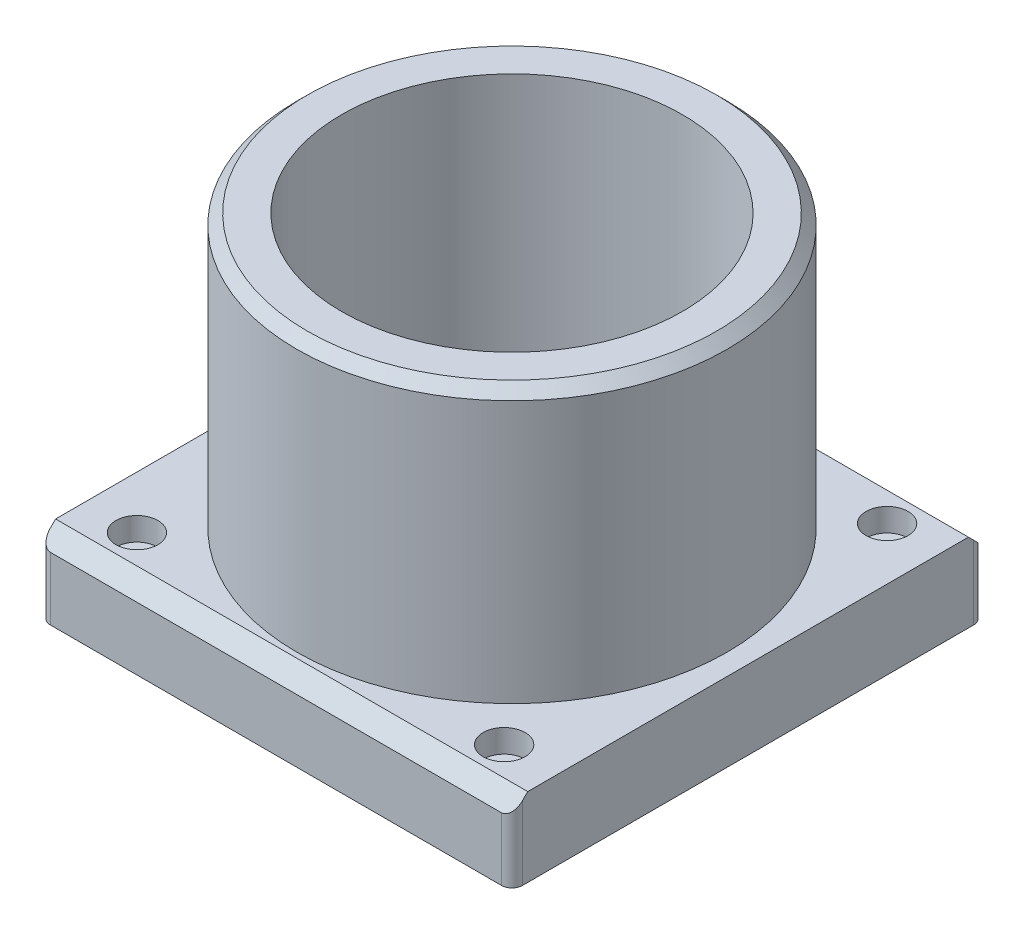
ISO-10303-21;
HEADER;
FILE_DESCRIPTION(('STEP AP214'),'2;1');
FILE_NAME('part.step','',(''),(''),'','','');
FILE_SCHEMA(('AUTOMOTIVE_DESIGN { 1 0 10303 214 1 1 1 1 }'));
ENDSEC;
DATA;
#1=APPLICATION_CONTEXT('core data for automotive mechanical design processes');
#2=APPLICATION_PROTOCOL_DEFINITION('international standard','automotive_design',2000,#1);
#3=PRODUCT_CONTEXT('',#1,'mechanical');
#4=PRODUCT('Part','Part','',(#3));
#5=PRODUCT_RELATED_PRODUCT_CATEGORY('part','',(#4));
#6=PRODUCT_DEFINITION_FORMATION('','',#4);
#7=PRODUCT_DEFINITION_CONTEXT('part definition',#1,'design');
#8=PRODUCT_DEFINITION('design','',#6,#7);
#9=PRODUCT_DEFINITION_SHAPE('','',#8);
#10=(LENGTH_UNIT() NAMED_UNIT(*) SI_UNIT(.MILLI.,.METRE.));
#11=(NAMED_UNIT(*) PLANE_ANGLE_UNIT() SI_UNIT($,.RADIAN.));
#12=(NAMED_UNIT(*) SI_UNIT($,.STERADIAN.) SOLID_ANGLE_UNIT());
#13=UNCERTAINTY_MEASURE_WITH_UNIT(LENGTH_MEASURE(1.E-05),#10,'distance_accuracy_value','');
#14=(GEOMETRIC_REPRESENTATION_CONTEXT(3) GLOBAL_UNCERTAINTY_ASSIGNED_CONTEXT((#13)) GLOBAL_UNIT_ASSIGNED_CONTEXT((#10,
#11,#12)) REPRESENTATION_CONTEXT('',''));
#15=CARTESIAN_POINT('',(0.,0.,0.));
#16=DIRECTION('',(0.,0.,1.));
#17=DIRECTION('',(1.,0.,0.));
#18=AXIS2_PLACEMENT_3D('',#15,#16,#17);
#19=CARTESIAN_POINT('',(0.,15.,0.));
#20=DIRECTION('',(0.,1.,0.));
#21=DIRECTION('',(0.,0.,1.));
#22=AXIS2_PLACEMENT_3D('',#19,#20,#21);
#23=PLANE('',#22);
#24=CARTESIAN_POINT('',(-35.,15.,-36.5));
#25=DIRECTION('',(0.,1.,0.));
#26=DIRECTION('',(0.,0.,1.));
#27=AXIS2_PLACEMENT_3D('',#24,#25,#26);
#28=CIRCLE('',#27,4.);
#29=CARTESIAN_POINT('',(-35.,15.,-32.5));
#30=VERTEX_POINT('',#29);
#31=EDGE_CURVE('E454',#30,#30,#28,.T.);
#32=ORIENTED_EDGE('',*,*,#31,.F.);
#33=EDGE_LOOP('',(#32));
#34=FACE_BOUND('',#33,.T.);
#35=CARTESIAN_POINT('',(35.,15.,-36.5));
#36=DIRECTION('',(0.,1.,0.));
#37=DIRECTION('',(0.,0.,1.));
#38=AXIS2_PLACEMENT_3D('',#35,#36,#37);
#39=CIRCLE('',#38,4.);
#40=CARTESIAN_POINT('',(35.,15.,-32.5));
#41=VERTEX_POINT('',#40);
#42=EDGE_CURVE('E468',#41,#41,#39,.T.);
#43=ORIENTED_EDGE('',*,*,#42,.F.);
#44=EDGE_LOOP('',(#43));
#45=FACE_BOUND('',#44,.T.);
#46=CARTESIAN_POINT('',(-35.,15.,36.5));
#47=DIRECTION('',(0.,1.,0.));
#48=DIRECTION('',(0.,0.,1.));
#49=AXIS2_PLACEMENT_3D('',#46,#47,#48);
#50=CIRCLE('',#49,4.);
#51=CARTESIAN_POINT('',(-35.,15.,40.5));
#52=VERTEX_POINT('',#51);
#53=EDGE_CURVE('E480',#52,#52,#50,.T.);
#54=ORIENTED_EDGE('',*,*,#53,.F.);
#55=EDGE_LOOP('',(#54));
#56=FACE_BOUND('',#55,.T.);
#57=CARTESIAN_POINT('',(35.,15.,36.5));
#58=DIRECTION('',(0.,1.,0.));
#59=DIRECTION('',(0.,0.,1.));
#60=AXIS2_PLACEMENT_3D('',#57,#58,#59);
#61=CIRCLE('',#60,4.);
#62=CARTESIAN_POINT('',(35.,15.,40.5));
#63=VERTEX_POINT('',#62);
#64=EDGE_CURVE('E492',#63,#63,#61,.T.);
#65=ORIENTED_EDGE('',*,*,#64,.F.);
#66=EDGE_LOOP('',(#65));
#67=FACE_BOUND('',#66,.T.);
#68=DIRECTION('',(0.,0.,-1.));
#69=VECTOR('',#68,1.);
#70=CARTESIAN_POINT('',(45.,15.,-45.));
#71=LINE('',#70,#69);
#72=CARTESIAN_POINT('',(45.,15.,42.));
#73=VERTEX_POINT('',#72);
#74=CARTESIAN_POINT('',(45.,15.,-42.));
#75=VERTEX_POINT('',#74);
#76=EDGE_CURVE('E139',#73,#75,#71,.T.);
#77=ORIENTED_EDGE('',*,*,#76,.T.);
#78=DIRECTION('',(-1.,0.,0.));
#79=VECTOR('',#78,1.);
#80=CARTESIAN_POINT('',(-45.,15.,-42.));
#81=LINE('',#80,#79);
#82=CARTESIAN_POINT('',(-45.,15.,-42.));
#83=VERTEX_POINT('',#82);
#84=EDGE_CURVE('E121',#75,#83,#81,.T.);
#85=ORIENTED_EDGE('',*,*,#84,.T.);
#86=DIRECTION('',(0.,0.,1.));
#87=VECTOR('',#86,1.);
#88=CARTESIAN_POINT('',(-45.,15.,-45.));
#89=LINE('',#88,#87);
#90=CARTESIAN_POINT('',(-45.,15.,42.));
#91=VERTEX_POINT('',#90);
#92=EDGE_CURVE('E136',#83,#91,#89,.T.);
#93=ORIENTED_EDGE('',*,*,#92,.T.);
#94=DIRECTION('',(1.,0.,0.));
#95=VECTOR('',#94,1.);
#96=CARTESIAN_POINT('',(45.,15.,42.));
#97=LINE('',#96,#95);
#98=EDGE_CURVE('E140',#91,#73,#97,.T.);
#99=ORIENTED_EDGE('',*,*,#98,.T.);
#100=EDGE_LOOP('',(#77,#85,#93,#99));
#101=FACE_BOUND('',#100,.T.);
#102=CARTESIAN_POINT('',(0.,15.,0.));
#103=DIRECTION('',(0.,1.,0.));
#104=DIRECTION('',(0.,0.,1.));
#105=AXIS2_PLACEMENT_3D('',#102,#103,#104);
#106=CIRCLE('',#105,41.);
#107=CARTESIAN_POINT('',(0.,15.,-41.));
#108=VERTEX_POINT('',#107);
#109=EDGE_CURVE('E150',#108,#108,#106,.T.);
#110=ORIENTED_EDGE('',*,*,#109,.F.);
#111=EDGE_LOOP('',(#110));
#112=FACE_BOUND('',#111,.T.);
#113=ADVANCED_FACE('F37',(#34,#45,#56,#67,#101,#112),#23,.T.);
#114=CARTESIAN_POINT('',(-45.,15.,-45.));
#115=DIRECTION('',(1.,0.,0.));
#116=DIRECTION('',(0.,0.,-1.));
#117=AXIS2_PLACEMENT_3D('',#114,#115,#116);
#118=PLANE('',#117);
#119=DIRECTION('',(0.,-0.707106781186549,-0.707106781186546));
#120=VECTOR('',#119,1.);
#121=CARTESIAN_POINT('',(-45.,15.,-42.));
#122=LINE('',#121,#120);
#123=CARTESIAN_POINT('',(-45.,14.,-43.));
#124=VERTEX_POINT('',#123);
#125=EDGE_CURVE('E116',#83,#124,#122,.T.);
#126=ORIENTED_EDGE('',*,*,#125,.T.);
#127=DIRECTION('',(0.,-1.,0.));
#128=VECTOR('',#127,1.);
#129=CARTESIAN_POINT('',(-45.,15.,-43.));
#130=LINE('',#129,#128);
#131=CARTESIAN_POINT('',(-45.,0.,-43.));
#132=VERTEX_POINT('',#131);
#133=EDGE_CURVE('E173',#124,#132,#130,.T.);
#134=ORIENTED_EDGE('',*,*,#133,.T.);
#135=DIRECTION('',(0.,0.,1.));
#136=VECTOR('',#135,1.);
#137=CARTESIAN_POINT('',(-45.,0.,-45.));
#138=LINE('',#137,#136);
#139=CARTESIAN_POINT('',(-45.,0.,43.));
#140=VERTEX_POINT('',#139);
#141=EDGE_CURVE('E153',#132,#140,#138,.T.);
#142=ORIENTED_EDGE('',*,*,#141,.T.);
#143=DIRECTION('',(0.,-1.,0.));
#144=VECTOR('',#143,1.);
#145=CARTESIAN_POINT('',(-45.,15.,43.));
#146=LINE('',#145,#144);
#147=CARTESIAN_POINT('',(-45.,14.,43.));
#148=VERTEX_POINT('',#147);
#149=EDGE_CURVE('E171',#140,#148,#146,.F.);
#150=ORIENTED_EDGE('',*,*,#149,.T.);
#151=DIRECTION('',(0.,0.707106781186549,-0.707106781186546));
#152=VECTOR('',#151,1.);
#153=CARTESIAN_POINT('',(-45.,15.,42.));
#154=LINE('',#153,#152);
#155=EDGE_CURVE('E129',#148,#91,#154,.T.);
#156=ORIENTED_EDGE('',*,*,#155,.T.);
#157=ORIENTED_EDGE('',*,*,#92,.F.);
#158=EDGE_LOOP('',(#126,#134,#142,#150,#156,#157));
#159=FACE_BOUND('',#158,.T.);
#160=ADVANCED_FACE('F142',(#159),#118,.F.);
#161=CARTESIAN_POINT('',(-45.,15.,45.));
#162=DIRECTION('',(0.,0.,-1.));
#163=DIRECTION('',(-1.,0.,0.));
#164=AXIS2_PLACEMENT_3D('',#161,#162,#163);
#165=PLANE('',#164);
#166=DIRECTION('',(1.,0.,0.));
#167=VECTOR('',#166,1.);
#168=CARTESIAN_POINT('',(-45.,0.,45.));
#169=LINE('',#168,#167);
#170=CARTESIAN_POINT('',(-43.,0.,45.));
#171=VERTEX_POINT('',#170);
#172=CARTESIAN_POINT('',(43.,0.,45.));
#173=VERTEX_POINT('',#172);
#174=EDGE_CURVE('E156',#171,#173,#169,.T.);
#175=ORIENTED_EDGE('',*,*,#174,.T.);
#176=DIRECTION('',(0.,-1.,0.));
#177=VECTOR('',#176,1.);
#178=CARTESIAN_POINT('',(43.,15.,45.));
#179=LINE('',#178,#177);
#180=CARTESIAN_POINT('',(43.,12.,45.));
#181=VERTEX_POINT('',#180);
#182=EDGE_CURVE('E59',#173,#181,#179,.F.);
#183=ORIENTED_EDGE('',*,*,#182,.T.);
#184=DIRECTION('',(-1.,0.,0.));
#185=VECTOR('',#184,1.);
#186=CARTESIAN_POINT('',(-45.,12.,45.));
#187=LINE('',#186,#185);
#188=CARTESIAN_POINT('',(-43.,12.,45.));
#189=VERTEX_POINT('',#188);
#190=EDGE_CURVE('E169',#181,#189,#187,.T.);
#191=ORIENTED_EDGE('',*,*,#190,.T.);
#192=DIRECTION('',(0.,-1.,0.));
#193=VECTOR('',#192,1.);
#194=CARTESIAN_POINT('',(-43.,15.,45.));
#195=LINE('',#194,#193);
#196=EDGE_CURVE('E196',#189,#171,#195,.T.);
#197=ORIENTED_EDGE('',*,*,#196,.T.);
#198=EDGE_LOOP('',(#175,#183,#191,#197));
#199=FACE_BOUND('',#198,.T.);
#200=ADVANCED_FACE('F227',(#199),#165,.F.);
#201=CARTESIAN_POINT('',(45.,15.,-45.));
#202=DIRECTION('',(-1.,0.,0.));
#203=DIRECTION('',(0.,0.,1.));
#204=AXIS2_PLACEMENT_3D('',#201,#202,#203);
#205=PLANE('',#204);
#206=DIRECTION('',(0.,0.,-1.));
#207=VECTOR('',#206,1.);
#208=CARTESIAN_POINT('',(45.,0.,-45.));
#209=LINE('',#208,#207);
#210=CARTESIAN_POINT('',(45.,0.,43.));
#211=VERTEX_POINT('',#210);
#212=CARTESIAN_POINT('',(45.,0.,-43.));
#213=VERTEX_POINT('',#212);
#214=EDGE_CURVE('E147',#211,#213,#209,.T.);
#215=ORIENTED_EDGE('',*,*,#214,.T.);
#216=DIRECTION('',(0.,-1.,0.));
#217=VECTOR('',#216,1.);
#218=CARTESIAN_POINT('',(45.,15.,-43.));
#219=LINE('',#218,#217);
#220=CARTESIAN_POINT('',(45.,14.,-43.));
#221=VERTEX_POINT('',#220);
#222=EDGE_CURVE('E194',#213,#221,#219,.F.);
#223=ORIENTED_EDGE('',*,*,#222,.T.);
#224=DIRECTION('',(0.,0.707106781186549,0.707106781186546));
#225=VECTOR('',#224,1.);
#226=CARTESIAN_POINT('',(45.,15.,-42.));
#227=LINE('',#226,#225);
#228=EDGE_CURVE('E167',#221,#75,#227,.T.);
#229=ORIENTED_EDGE('',*,*,#228,.T.);
#230=ORIENTED_EDGE('',*,*,#76,.F.);
#231=DIRECTION('',(0.,-0.707106781186549,0.707106781186546));
#232=VECTOR('',#231,1.);
#233=CARTESIAN_POINT('',(45.,15.,42.));
#234=LINE('',#233,#232);
#235=CARTESIAN_POINT('',(45.,14.,43.));
#236=VERTEX_POINT('',#235);
#237=EDGE_CURVE('E164',#73,#236,#234,.T.);
#238=ORIENTED_EDGE('',*,*,#237,.T.);
#239=DIRECTION('',(0.,-1.,0.));
#240=VECTOR('',#239,1.);
#241=CARTESIAN_POINT('',(45.,15.,43.));
#242=LINE('',#241,#240);
#243=EDGE_CURVE('E191',#236,#211,#242,.T.);
#244=ORIENTED_EDGE('',*,*,#243,.T.);
#245=EDGE_LOOP('',(#215,#223,#229,#230,#238,#244));
#246=FACE_BOUND('',#245,.T.);
#247=ADVANCED_FACE('F242',(#246),#205,.F.);
#248=CARTESIAN_POINT('',(-45.,15.,-45.));
#249=DIRECTION('',(0.,0.,1.));
#250=DIRECTION('',(1.,0.,0.));
#251=AXIS2_PLACEMENT_3D('',#248,#249,#250);
#252=PLANE('',#251);
#253=DIRECTION('',(-1.,0.,0.));
#254=VECTOR('',#253,1.);
#255=CARTESIAN_POINT('',(-45.,0.,-45.));
#256=LINE('',#255,#254);
#257=CARTESIAN_POINT('',(43.,0.,-45.));
#258=VERTEX_POINT('',#257);
#259=CARTESIAN_POINT('',(-43.,0.,-45.));
#260=VERTEX_POINT('',#259);
#261=EDGE_CURVE('E143',#258,#260,#256,.T.);
#262=ORIENTED_EDGE('',*,*,#261,.T.);
#263=DIRECTION('',(0.,-1.,0.));
#264=VECTOR('',#263,1.);
#265=CARTESIAN_POINT('',(-43.,15.,-45.));
#266=LINE('',#265,#264);
#267=CARTESIAN_POINT('',(-43.,12.,-45.));
#268=VERTEX_POINT('',#267);
#269=EDGE_CURVE('E186',#260,#268,#266,.F.);
#270=ORIENTED_EDGE('',*,*,#269,.T.);
#271=DIRECTION('',(1.,0.,0.));
#272=VECTOR('',#271,1.);
#273=CARTESIAN_POINT('',(45.,12.,-45.));
#274=LINE('',#273,#272);
#275=CARTESIAN_POINT('',(43.,12.,-45.));
#276=VERTEX_POINT('',#275);
#277=EDGE_CURVE('E128',#268,#276,#274,.T.);
#278=ORIENTED_EDGE('',*,*,#277,.T.);
#279=DIRECTION('',(0.,-1.,0.));
#280=VECTOR('',#279,1.);
#281=CARTESIAN_POINT('',(43.,15.,-45.));
#282=LINE('',#281,#280);
#283=EDGE_CURVE('E183',#276,#258,#282,.T.);
#284=ORIENTED_EDGE('',*,*,#283,.T.);
#285=EDGE_LOOP('',(#262,#270,#278,#284));
#286=FACE_BOUND('',#285,.T.);
#287=ADVANCED_FACE('F238',(#286),#252,.F.);
#288=CARTESIAN_POINT('',(0.,0.,0.));
#289=DIRECTION('',(0.,1.,0.));
#290=DIRECTION('',(0.,0.,1.));
#291=AXIS2_PLACEMENT_3D('',#288,#289,#290);
#292=PLANE('',#291);
#293=CARTESIAN_POINT('',(0.,0.,0.));
#294=DIRECTION('',(0.,1.,0.));
#295=DIRECTION('',(0.,0.,1.));
#296=AXIS2_PLACEMENT_3D('',#293,#294,#295);
#297=CIRCLE('',#296,32.5);
#298=CARTESIAN_POINT('',(0.,0.,32.5));
#299=VERTEX_POINT('',#298);
#300=EDGE_CURVE('E449',#299,#299,#297,.T.);
#301=ORIENTED_EDGE('',*,*,#300,.T.);
#302=EDGE_LOOP('',(#301));
#303=FACE_BOUND('',#302,.T.);
#304=CARTESIAN_POINT('',(-35.,0.,-36.5));
#305=DIRECTION('',(0.,1.,0.));
#306=DIRECTION('',(0.,0.,1.));
#307=AXIS2_PLACEMENT_3D('',#304,#305,#306);
#308=CIRCLE('',#307,2.25);
#309=CARTESIAN_POINT('',(-35.,0.,-34.25));
#310=VERTEX_POINT('',#309);
#311=EDGE_CURVE('E465',#310,#310,#308,.T.);
#312=ORIENTED_EDGE('',*,*,#311,.T.);
#313=EDGE_LOOP('',(#312));
#314=FACE_BOUND('',#313,.T.);
#315=CARTESIAN_POINT('',(35.,0.,-36.5));
#316=DIRECTION('',(0.,1.,0.));
#317=DIRECTION('',(0.,0.,1.));
#318=AXIS2_PLACEMENT_3D('',#315,#316,#317);
#319=CIRCLE('',#318,2.25);
#320=CARTESIAN_POINT('',(35.,0.,-34.25));
#321=VERTEX_POINT('',#320);
#322=EDGE_CURVE('E477',#321,#321,#319,.T.);
#323=ORIENTED_EDGE('',*,*,#322,.T.);
#324=EDGE_LOOP('',(#323));
#325=FACE_BOUND('',#324,.T.);
#326=CARTESIAN_POINT('',(-35.,0.,36.5));
#327=DIRECTION('',(0.,1.,0.));
#328=DIRECTION('',(0.,0.,1.));
#329=AXIS2_PLACEMENT_3D('',#326,#327,#328);
#330=CIRCLE('',#329,2.25);
#331=CARTESIAN_POINT('',(-35.,0.,38.75));
#332=VERTEX_POINT('',#331);
#333=EDGE_CURVE('E489',#332,#332,#330,.T.);
#334=ORIENTED_EDGE('',*,*,#333,.T.);
#335=EDGE_LOOP('',(#334));
#336=FACE_BOUND('',#335,.T.);
#337=CARTESIAN_POINT('',(35.,0.,36.5));
#338=DIRECTION('',(0.,1.,0.));
#339=DIRECTION('',(0.,0.,1.));
#340=AXIS2_PLACEMENT_3D('',#337,#338,#339);
#341=CIRCLE('',#340,2.25);
#342=CARTESIAN_POINT('',(35.,0.,38.75));
#343=VERTEX_POINT('',#342);
#344=EDGE_CURVE('E500',#343,#343,#341,.T.);
#345=ORIENTED_EDGE('',*,*,#344,.T.);
#346=EDGE_LOOP('',(#345));
#347=FACE_BOUND('',#346,.T.);
#348=ORIENTED_EDGE('',*,*,#141,.F.);
#349=CARTESIAN_POINT('',(-43.,0.,-43.));
#350=DIRECTION('',(0.,1.,0.));
#351=DIRECTION('',(0.,0.,1.));
#352=AXIS2_PLACEMENT_3D('',#349,#350,#351);
#353=CIRCLE('',#352,2.);
#354=EDGE_CURVE('E181',#132,#260,#353,.F.);
#355=ORIENTED_EDGE('',*,*,#354,.T.);
#356=ORIENTED_EDGE('',*,*,#261,.F.);
#357=CARTESIAN_POINT('',(43.,0.,-43.));
#358=DIRECTION('',(0.,1.,0.));
#359=DIRECTION('',(0.,0.,1.));
#360=AXIS2_PLACEMENT_3D('',#357,#358,#359);
#361=CIRCLE('',#360,2.);
#362=EDGE_CURVE('E179',#258,#213,#361,.F.);
#363=ORIENTED_EDGE('',*,*,#362,.T.);
#364=ORIENTED_EDGE('',*,*,#214,.F.);
#365=CARTESIAN_POINT('',(43.,0.,43.));
#366=DIRECTION('',(0.,1.,0.));
#367=DIRECTION('',(0.,0.,1.));
#368=AXIS2_PLACEMENT_3D('',#365,#366,#367);
#369=CIRCLE('',#368,2.);
#370=EDGE_CURVE('E177',#211,#173,#369,.F.);
#371=ORIENTED_EDGE('',*,*,#370,.T.);
#372=ORIENTED_EDGE('',*,*,#174,.F.);
#373=CARTESIAN_POINT('',(-43.,0.,43.));
#374=DIRECTION('',(0.,1.,0.));
#375=DIRECTION('',(0.,0.,1.));
#376=AXIS2_PLACEMENT_3D('',#373,#374,#375);
#377=CIRCLE('',#376,2.);
#378=EDGE_CURVE('E175',#171,#140,#377,.F.);
#379=ORIENTED_EDGE('',*,*,#378,.T.);
#380=EDGE_LOOP('',(#348,#355,#356,#363,#364,#371,#372,#379));
#381=FACE_BOUND('',#380,.T.);
#382=ADVANCED_FACE('F235',(#303,#314,#325,#336,#347,#381),#292,.F.);
#383=CARTESIAN_POINT('',(0.,67.,0.));
#384=DIRECTION('',(0.,-1.,0.));
#385=DIRECTION('',(0.,0.,-1.));
#386=AXIS2_PLACEMENT_3D('',#383,#384,#385);
#387=CYLINDRICAL_SURFACE('',#386,41.);
#388=CARTESIAN_POINT('',(0.,65.0000000000001,0.));
#389=DIRECTION('',(0.,1.,0.));
#390=DIRECTION('',(0.,0.,1.));
#391=AXIS2_PLACEMENT_3D('',#388,#389,#390);
#392=CIRCLE('',#391,41.);
#393=CARTESIAN_POINT('',(0.,65.0000000000001,-41.));
#394=VERTEX_POINT('',#393);
#395=EDGE_CURVE('E11',#394,#394,#392,.F.);
#396=CARTESIAN_POINT('',(0.,65.0000000000001,-41.));
#397=CARTESIAN_POINT('',(0.,64.4791666666668,-41.));
#398=CARTESIAN_POINT('',(0.,63.9583333333334,-41.));
#399=CARTESIAN_POINT('',(0.,62.9166666666668,-41.));
#400=CARTESIAN_POINT('',(0.,62.3958333333334,-41.));
#401=CARTESIAN_POINT('',(0.,61.3541666666668,-41.));
#402=CARTESIAN_POINT('',(0.,60.8333333333334,-41.));
#403=CARTESIAN_POINT('',(0.,59.7916666666668,-41.));
#404=CARTESIAN_POINT('',(0.,59.2708333333334,-41.));
#405=CARTESIAN_POINT('',(0.,58.2291666666668,-41.));
#406=CARTESIAN_POINT('',(0.,57.7083333333334,-41.));
#407=CARTESIAN_POINT('',(0.,56.6666666666668,-41.));
#408=CARTESIAN_POINT('',(0.,56.1458333333334,-41.));
#409=CARTESIAN_POINT('',(0.,55.1041666666667,-41.));
#410=CARTESIAN_POINT('',(0.,54.5833333333334,-41.));
#411=CARTESIAN_POINT('',(0.,53.5416666666667,-41.));
#412=CARTESIAN_POINT('',(0.,53.0208333333334,-41.));
#413=CARTESIAN_POINT('',(0.,51.9791666666667,-41.));
#414=CARTESIAN_POINT('',(0.,51.4583333333334,-41.));
#415=CARTESIAN_POINT('',(0.,50.4166666666667,-41.));
#416=CARTESIAN_POINT('',(0.,49.8958333333334,-41.));
#417=CARTESIAN_POINT('',(0.,48.8541666666667,-41.));
#418=CARTESIAN_POINT('',(0.,48.3333333333334,-41.));
#419=CARTESIAN_POINT('',(0.,47.2916666666667,-41.));
#420=CARTESIAN_POINT('',(0.,46.7708333333334,-41.));
#421=CARTESIAN_POINT('',(0.,45.7291666666667,-41.));
#422=CARTESIAN_POINT('',(0.,45.2083333333334,-41.));
#423=CARTESIAN_POINT('',(0.,44.1666666666667,-41.));
#424=CARTESIAN_POINT('',(0.,43.6458333333334,-41.));
#425=CARTESIAN_POINT('',(0.,42.6041666666667,-41.));
#426=CARTESIAN_POINT('',(0.,42.0833333333334,-41.));
#427=CARTESIAN_POINT('',(0.,41.0416666666667,-41.));
#428=CARTESIAN_POINT('',(0.,40.5208333333334,-41.));
#429=CARTESIAN_POINT('',(0.,39.4791666666667,-41.));
#430=CARTESIAN_POINT('',(0.,38.9583333333334,-41.));
#431=CARTESIAN_POINT('',(0.,37.9166666666667,-41.));
#432=CARTESIAN_POINT('',(0.,37.3958333333334,-41.));
#433=CARTESIAN_POINT('',(0.,36.3541666666667,-41.));
#434=CARTESIAN_POINT('',(0.,35.8333333333334,-41.));
#435=CARTESIAN_POINT('',(0.,34.7916666666667,-41.));
#436=CARTESIAN_POINT('',(0.,34.2708333333334,-41.));
#437=CARTESIAN_POINT('',(0.,33.2291666666667,-41.));
#438=CARTESIAN_POINT('',(0.,32.7083333333334,-41.));
#439=CARTESIAN_POINT('',(0.,31.6666666666667,-41.));
#440=CARTESIAN_POINT('',(0.,31.1458333333334,-41.));
#441=CARTESIAN_POINT('',(0.,30.1041666666667,-41.));
#442=CARTESIAN_POINT('',(0.,29.5833333333334,-41.));
#443=CARTESIAN_POINT('',(0.,28.5416666666667,-41.));
#444=CARTESIAN_POINT('',(0.,28.0208333333334,-41.));
#445=CARTESIAN_POINT('',(0.,26.9791666666667,-41.));
#446=CARTESIAN_POINT('',(0.,26.4583333333333,-41.));
#447=CARTESIAN_POINT('',(0.,25.4166666666667,-41.));
#448=CARTESIAN_POINT('',(0.,24.8958333333333,-41.));
#449=CARTESIAN_POINT('',(0.,23.8541666666667,-41.));
#450=CARTESIAN_POINT('',(0.,23.3333333333333,-41.));
#451=CARTESIAN_POINT('',(0.,22.2916666666667,-41.));
#452=CARTESIAN_POINT('',(0.,21.7708333333333,-41.));
#453=CARTESIAN_POINT('',(0.,20.7291666666667,-41.));
#454=CARTESIAN_POINT('',(0.,20.2083333333333,-41.));
#455=CARTESIAN_POINT('',(0.,19.1666666666667,-41.));
#456=CARTESIAN_POINT('',(0.,18.6458333333333,-41.));
#457=CARTESIAN_POINT('',(0.,17.6041666666667,-41.));
#458=CARTESIAN_POINT('',(0.,17.0833333333333,-41.));
#459=CARTESIAN_POINT('',(0.,16.0416666666667,-41.));
#460=CARTESIAN_POINT('',(0.,15.5208333333333,-41.));
#461=CARTESIAN_POINT('',(0.,15.,-41.));
#462=B_SPLINE_CURVE_WITH_KNOTS('',3,(#396,#397,#398,#399,#400,#401,#402,#403,#404,#405,#406,
#407,#408,#409,#410,#411,#412,#413,#414,#415,#416,#417,#418,#419,#420,#421,#422,#423,#424,#425,
#426,#427,#428,#429,#430,#431,#432,#433,#434,#435,#436,#437,#438,#439,#440,#441,#442,#443,#444,
#445,#446,#447,#448,#449,#450,#451,#452,#453,#454,#455,#456,#457,#458,#459,#460,#461),
.UNSPECIFIED.,.F.,.F.,(4,2,2,2,2,2,2,2,2,2,2,2,2,2,2,2,2,2,2,2,2,2,2,2,2,2,2,2,2,2,2,2,4),(0.,
1.56249999999999,3.125,4.6875,6.25000000000001,7.81250000000001,9.37500000000002,10.9375,12.5,
14.0625,15.625,17.1875,18.75,20.3125,21.875,23.4375,25.,26.5625000000001,28.1250000000001,
29.6875000000001,31.2500000000001,32.8125000000001,34.3750000000001,35.9375000000001,
37.5000000000001,39.0625000000001,40.6250000000001,42.1875000000001,43.7500000000001,
45.3125000000001,46.8750000000001,48.4375000000001,50.0000000000001),.UNSPECIFIED.);
#463=EDGE_CURVE('BSEAM233',#394,#108,#462,.T.);
#464=ORIENTED_EDGE('',*,*,#395,.T.);
#465=ORIENTED_EDGE('',*,*,#109,.T.);
#466=ORIENTED_EDGE('',*,*,#463,.T.);
#467=ORIENTED_EDGE('',*,*,#463,.F.);
#468=EDGE_LOOP('',(#464,#466,#465,#467));
#469=FACE_BOUND('',#468,.T.);
#470=ADVANCED_FACE('F233',(#469),#387,.T.);
#471=CARTESIAN_POINT('',(0.,67.,0.));
#472=DIRECTION('',(0.,1.,0.));
#473=DIRECTION('',(0.,0.,1.));
#474=AXIS2_PLACEMENT_3D('',#471,#472,#473);
#475=PLANE('',#474);
#476=CARTESIAN_POINT('',(0.,67.,0.));
#477=DIRECTION('',(0.,1.,0.));
#478=DIRECTION('',(0.,0.,1.));
#479=AXIS2_PLACEMENT_3D('',#476,#477,#478);
#480=CIRCLE('',#479,32.5);
#481=CARTESIAN_POINT('',(0.,67.,32.5));
#482=VERTEX_POINT('',#481);
#483=EDGE_CURVE('E452',#482,#482,#480,.T.);
#484=ORIENTED_EDGE('',*,*,#483,.F.);
#485=EDGE_LOOP('',(#484));
#486=FACE_BOUND('',#485,.T.);
#487=CARTESIAN_POINT('',(0.,67.,0.));
#488=DIRECTION('',(0.,1.,0.));
#489=DIRECTION('',(0.,0.,1.));
#490=AXIS2_PLACEMENT_3D('',#487,#488,#489);
#491=CIRCLE('',#490,39.0000000000001);
#492=CARTESIAN_POINT('',(0.,67.,39.0000000000001));
#493=VERTEX_POINT('',#492);
#494=EDGE_CURVE('E45',#493,#493,#491,.T.);
#495=ORIENTED_EDGE('',*,*,#494,.T.);
#496=EDGE_LOOP('',(#495));
#497=FACE_BOUND('',#496,.T.);
#498=ADVANCED_FACE('F205',(#486,#497),#475,.T.);
#499=CARTESIAN_POINT('',(0.,15.,-42.));
#500=DIRECTION('',(0.,0.707106781186546,-0.707106781186549));
#501=DIRECTION('',(1.,0.,0.));
#502=AXIS2_PLACEMENT_3D('',#499,#500,#501);
#503=PLANE('',#502);
#504=ORIENTED_EDGE('',*,*,#277,.F.);
#505=CARTESIAN_POINT('',(-43.,14.,-43.));
#506=DIRECTION('',(0.,0.707106781186546,-0.707106781186549));
#507=DIRECTION('',(0.,-0.707106781186549,-0.707106781186546));
#508=AXIS2_PLACEMENT_3D('',#505,#506,#507);
#509=ELLIPSE('',#508,2.8284271247462,2.);
#510=EDGE_CURVE('E123',#268,#124,#509,.T.);
#511=ORIENTED_EDGE('',*,*,#510,.T.);
#512=ORIENTED_EDGE('',*,*,#125,.F.);
#513=ORIENTED_EDGE('',*,*,#84,.F.);
#514=ORIENTED_EDGE('',*,*,#228,.F.);
#515=CARTESIAN_POINT('',(43.,14.,-43.));
#516=DIRECTION('',(0.,0.707106781186546,-0.707106781186549));
#517=DIRECTION('',(0.,-0.707106781186549,-0.707106781186546));
#518=AXIS2_PLACEMENT_3D('',#515,#516,#517);
#519=ELLIPSE('',#518,2.8284271247462,2.);
#520=EDGE_CURVE('E188',#221,#276,#519,.T.);
#521=ORIENTED_EDGE('',*,*,#520,.T.);
#522=EDGE_LOOP('',(#504,#511,#512,#513,#514,#521));
#523=FACE_BOUND('',#522,.T.);
#524=ADVANCED_FACE('F119',(#523),#503,.T.);
#525=CARTESIAN_POINT('',(0.,15.,42.));
#526=DIRECTION('',(0.,0.707106781186546,0.707106781186549));
#527=DIRECTION('',(-1.,0.,0.));
#528=AXIS2_PLACEMENT_3D('',#525,#526,#527);
#529=PLANE('',#528);
#530=ORIENTED_EDGE('',*,*,#190,.F.);
#531=CARTESIAN_POINT('',(43.,14.,43.));
#532=DIRECTION('',(0.,0.707106781186546,0.707106781186549));
#533=DIRECTION('',(0.,-0.707106781186549,0.707106781186546));
#534=AXIS2_PLACEMENT_3D('',#531,#532,#533);
#535=ELLIPSE('',#534,2.8284271247462,2.);
#536=EDGE_CURVE('E201',#181,#236,#535,.T.);
#537=ORIENTED_EDGE('',*,*,#536,.T.);
#538=ORIENTED_EDGE('',*,*,#237,.F.);
#539=ORIENTED_EDGE('',*,*,#98,.F.);
#540=ORIENTED_EDGE('',*,*,#155,.F.);
#541=CARTESIAN_POINT('',(-43.,14.,43.));
#542=DIRECTION('',(0.,0.707106781186546,0.707106781186549));
#543=DIRECTION('',(0.,-0.707106781186549,0.707106781186546));
#544=AXIS2_PLACEMENT_3D('',#541,#542,#543);
#545=ELLIPSE('',#544,2.8284271247462,2.);
#546=EDGE_CURVE('E52',#148,#189,#545,.T.);
#547=ORIENTED_EDGE('',*,*,#546,.T.);
#548=EDGE_LOOP('',(#530,#537,#538,#539,#540,#547));
#549=FACE_BOUND('',#548,.T.);
#550=ADVANCED_FACE('F251',(#549),#529,.T.);
#551=CARTESIAN_POINT('',(-43.,15.,-43.));
#552=DIRECTION('',(0.,-1.,0.));
#553=DIRECTION('',(0.,0.,-1.));
#554=AXIS2_PLACEMENT_3D('',#551,#552,#553);
#555=CYLINDRICAL_SURFACE('',#554,2.);
#556=ORIENTED_EDGE('',*,*,#510,.F.);
#557=ORIENTED_EDGE('',*,*,#269,.F.);
#558=ORIENTED_EDGE('',*,*,#354,.F.);
#559=ORIENTED_EDGE('',*,*,#133,.F.);
#560=EDGE_LOOP('',(#556,#557,#558,#559));
#561=FACE_BOUND('',#560,.T.);
#562=ADVANCED_FACE('F254',(#561),#555,.T.);
#563=CARTESIAN_POINT('',(43.,15.,-43.));
#564=DIRECTION('',(0.,-1.,0.));
#565=DIRECTION('',(0.,0.,-1.));
#566=AXIS2_PLACEMENT_3D('',#563,#564,#565);
#567=CYLINDRICAL_SURFACE('',#566,2.);
#568=ORIENTED_EDGE('',*,*,#520,.F.);
#569=ORIENTED_EDGE('',*,*,#222,.F.);
#570=ORIENTED_EDGE('',*,*,#362,.F.);
#571=ORIENTED_EDGE('',*,*,#283,.F.);
#572=EDGE_LOOP('',(#568,#569,#570,#571));
#573=FACE_BOUND('',#572,.T.);
#574=ADVANCED_FACE('F257',(#573),#567,.T.);
#575=CARTESIAN_POINT('',(43.,15.,43.));
#576=DIRECTION('',(0.,-1.,0.));
#577=DIRECTION('',(0.,0.,-1.));
#578=AXIS2_PLACEMENT_3D('',#575,#576,#577);
#579=CYLINDRICAL_SURFACE('',#578,2.);
#580=ORIENTED_EDGE('',*,*,#536,.F.);
#581=ORIENTED_EDGE('',*,*,#182,.F.);
#582=ORIENTED_EDGE('',*,*,#370,.F.);
#583=ORIENTED_EDGE('',*,*,#243,.F.);
#584=EDGE_LOOP('',(#580,#581,#582,#583));
#585=FACE_BOUND('',#584,.T.);
#586=ADVANCED_FACE('F218',(#585),#579,.T.);
#587=CARTESIAN_POINT('',(-43.,15.,43.));
#588=DIRECTION('',(0.,-1.,0.));
#589=DIRECTION('',(0.,0.,-1.));
#590=AXIS2_PLACEMENT_3D('',#587,#588,#589);
#591=CYLINDRICAL_SURFACE('',#590,2.);
#592=ORIENTED_EDGE('',*,*,#546,.F.);
#593=ORIENTED_EDGE('',*,*,#149,.F.);
#594=ORIENTED_EDGE('',*,*,#378,.F.);
#595=ORIENTED_EDGE('',*,*,#196,.F.);
#596=EDGE_LOOP('',(#592,#593,#594,#595));
#597=FACE_BOUND('',#596,.T.);
#598=ADVANCED_FACE('F209',(#597),#591,.T.);
#599=CARTESIAN_POINT('',(0.,67.,0.));
#600=DIRECTION('',(0.,-1.,0.));
#601=DIRECTION('',(0.,0.,-1.));
#602=AXIS2_PLACEMENT_3D('',#599,#600,#601);
#603=CONICAL_SURFACE('',#602,39.0000000000001,0.785398163397448);
#604=ORIENTED_EDGE('',*,*,#395,.F.);
#605=EDGE_LOOP('',(#604));
#606=FACE_BOUND('',#605,.T.);
#607=ORIENTED_EDGE('',*,*,#494,.F.);
#608=EDGE_LOOP('',(#607));
#609=FACE_BOUND('',#608,.T.);
#610=ADVANCED_FACE('F39',(#606,#609),#603,.T.);
#611=CARTESIAN_POINT('',(35.,15.,36.5));
#612=DIRECTION('',(0.,1.,0.));
#613=DIRECTION('',(0.,0.,1.));
#614=AXIS2_PLACEMENT_3D('',#611,#612,#613);
#615=CYLINDRICAL_SURFACE('',#614,2.25);
#616=ORIENTED_EDGE('',*,*,#344,.F.);
#617=EDGE_LOOP('',(#616));
#618=FACE_BOUND('',#617,.T.);
#619=CARTESIAN_POINT('',(35.,10.6,36.5));
#620=DIRECTION('',(0.,1.,0.));
#621=DIRECTION('',(0.,0.,1.));
#622=AXIS2_PLACEMENT_3D('',#619,#620,#621);
#623=CIRCLE('',#622,2.25);
#624=CARTESIAN_POINT('',(35.,10.6,38.75));
#625=VERTEX_POINT('',#624);
#626=EDGE_CURVE('E498',#625,#625,#623,.T.);
#627=ORIENTED_EDGE('',*,*,#626,.T.);
#628=EDGE_LOOP('',(#627));
#629=FACE_BOUND('',#628,.T.);
#630=ADVANCED_FACE('F208',(#618,#629),#615,.F.);
#631=CARTESIAN_POINT('',(37.25,10.6,36.5));
#632=DIRECTION('',(0.,-1.,0.));
#633=DIRECTION('',(0.,0.,-1.));
#634=AXIS2_PLACEMENT_3D('',#631,#632,#633);
#635=PLANE('',#634);
#636=ORIENTED_EDGE('',*,*,#626,.F.);
#637=EDGE_LOOP('',(#636));
#638=FACE_BOUND('',#637,.T.);
#639=CARTESIAN_POINT('',(35.,10.6,36.5));
#640=DIRECTION('',(0.,1.,0.));
#641=DIRECTION('',(0.,0.,1.));
#642=AXIS2_PLACEMENT_3D('',#639,#640,#641);
#643=CIRCLE('',#642,4.);
#644=CARTESIAN_POINT('',(35.,10.6,40.5));
#645=VERTEX_POINT('',#644);
#646=EDGE_CURVE('E495',#645,#645,#643,.T.);
#647=ORIENTED_EDGE('',*,*,#646,.T.);
#648=EDGE_LOOP('',(#647));
#649=FACE_BOUND('',#648,.T.);
#650=ADVANCED_FACE('F215',(#638,#649),#635,.F.);
#651=CARTESIAN_POINT('',(35.,15.,36.5));
#652=DIRECTION('',(0.,1.,0.));
#653=DIRECTION('',(0.,0.,1.));
#654=AXIS2_PLACEMENT_3D('',#651,#652,#653);
#655=CYLINDRICAL_SURFACE('',#654,4.);
#656=ORIENTED_EDGE('',*,*,#646,.F.);
#657=EDGE_LOOP('',(#656));
#658=FACE_BOUND('',#657,.T.);
#659=ORIENTED_EDGE('',*,*,#64,.T.);
#660=EDGE_LOOP('',(#659));
#661=FACE_BOUND('',#660,.T.);
#662=ADVANCED_FACE('F319',(#658,#661),#655,.F.);
#663=CARTESIAN_POINT('',(-35.,15.,36.5));
#664=DIRECTION('',(0.,1.,0.));
#665=DIRECTION('',(0.,0.,1.));
#666=AXIS2_PLACEMENT_3D('',#663,#664,#665);
#667=CYLINDRICAL_SURFACE('',#666,2.25);
#668=ORIENTED_EDGE('',*,*,#333,.F.);
#669=EDGE_LOOP('',(#668));
#670=FACE_BOUND('',#669,.T.);
#671=CARTESIAN_POINT('',(-35.,10.6,36.5));
#672=DIRECTION('',(0.,1.,0.));
#673=DIRECTION('',(0.,0.,1.));
#674=AXIS2_PLACEMENT_3D('',#671,#672,#673);
#675=CIRCLE('',#674,2.25);
#676=CARTESIAN_POINT('',(-35.,10.6,38.75));
#677=VERTEX_POINT('',#676);
#678=EDGE_CURVE('E486',#677,#677,#675,.T.);
#679=ORIENTED_EDGE('',*,*,#678,.T.);
#680=EDGE_LOOP('',(#679));
#681=FACE_BOUND('',#680,.T.);
#682=ADVANCED_FACE('F329',(#670,#681),#667,.F.);
#683=CARTESIAN_POINT('',(-32.75,10.6,36.5));
#684=DIRECTION('',(0.,-1.,0.));
#685=DIRECTION('',(0.,0.,-1.));
#686=AXIS2_PLACEMENT_3D('',#683,#684,#685);
#687=PLANE('',#686);
#688=ORIENTED_EDGE('',*,*,#678,.F.);
#689=EDGE_LOOP('',(#688));
#690=FACE_BOUND('',#689,.T.);
#691=CARTESIAN_POINT('',(-35.,10.6,36.5));
#692=DIRECTION('',(0.,1.,0.));
#693=DIRECTION('',(0.,0.,1.));
#694=AXIS2_PLACEMENT_3D('',#691,#692,#693);
#695=CIRCLE('',#694,4.);
#696=CARTESIAN_POINT('',(-35.,10.6,40.5));
#697=VERTEX_POINT('',#696);
#698=EDGE_CURVE('E483',#697,#697,#695,.T.);
#699=ORIENTED_EDGE('',*,*,#698,.T.);
#700=EDGE_LOOP('',(#699));
#701=FACE_BOUND('',#700,.T.);
#702=ADVANCED_FACE('F339',(#690,#701),#687,.F.);
#703=CARTESIAN_POINT('',(-35.,15.,36.5));
#704=DIRECTION('',(0.,1.,0.));
#705=DIRECTION('',(0.,0.,1.));
#706=AXIS2_PLACEMENT_3D('',#703,#704,#705);
#707=CYLINDRICAL_SURFACE('',#706,4.);
#708=ORIENTED_EDGE('',*,*,#698,.F.);
#709=EDGE_LOOP('',(#708));
#710=FACE_BOUND('',#709,.T.);
#711=ORIENTED_EDGE('',*,*,#53,.T.);
#712=EDGE_LOOP('',(#711));
#713=FACE_BOUND('',#712,.T.);
#714=ADVANCED_FACE('F349',(#710,#713),#707,.F.);
#715=CARTESIAN_POINT('',(35.,15.,-36.5));
#716=DIRECTION('',(0.,1.,0.));
#717=DIRECTION('',(0.,0.,1.));
#718=AXIS2_PLACEMENT_3D('',#715,#716,#717);
#719=CYLINDRICAL_SURFACE('',#718,2.25);
#720=ORIENTED_EDGE('',*,*,#322,.F.);
#721=EDGE_LOOP('',(#720));
#722=FACE_BOUND('',#721,.T.);
#723=CARTESIAN_POINT('',(35.,10.6,-36.5));
#724=DIRECTION('',(0.,1.,0.));
#725=DIRECTION('',(0.,0.,1.));
#726=AXIS2_PLACEMENT_3D('',#723,#724,#725);
#727=CIRCLE('',#726,2.25);
#728=CARTESIAN_POINT('',(35.,10.6,-34.25));
#729=VERTEX_POINT('',#728);
#730=EDGE_CURVE('E474',#729,#729,#727,.T.);
#731=ORIENTED_EDGE('',*,*,#730,.T.);
#732=EDGE_LOOP('',(#731));
#733=FACE_BOUND('',#732,.T.);
#734=ADVANCED_FACE('F359',(#722,#733),#719,.F.);
#735=CARTESIAN_POINT('',(37.25,10.6,-36.5));
#736=DIRECTION('',(0.,-1.,0.));
#737=DIRECTION('',(0.,0.,-1.));
#738=AXIS2_PLACEMENT_3D('',#735,#736,#737);
#739=PLANE('',#738);
#740=ORIENTED_EDGE('',*,*,#730,.F.);
#741=EDGE_LOOP('',(#740));
#742=FACE_BOUND('',#741,.T.);
#743=CARTESIAN_POINT('',(35.,10.6,-36.5));
#744=DIRECTION('',(0.,1.,0.));
#745=DIRECTION('',(0.,0.,1.));
#746=AXIS2_PLACEMENT_3D('',#743,#744,#745);
#747=CIRCLE('',#746,4.);
#748=CARTESIAN_POINT('',(35.,10.6,-32.5));
#749=VERTEX_POINT('',#748);
#750=EDGE_CURVE('E471',#749,#749,#747,.T.);
#751=ORIENTED_EDGE('',*,*,#750,.T.);
#752=EDGE_LOOP('',(#751));
#753=FACE_BOUND('',#752,.T.);
#754=ADVANCED_FACE('F369',(#742,#753),#739,.F.);
#755=CARTESIAN_POINT('',(35.,15.,-36.5));
#756=DIRECTION('',(0.,1.,0.));
#757=DIRECTION('',(0.,0.,1.));
#758=AXIS2_PLACEMENT_3D('',#755,#756,#757);
#759=CYLINDRICAL_SURFACE('',#758,4.);
#760=ORIENTED_EDGE('',*,*,#750,.F.);
#761=EDGE_LOOP('',(#760));
#762=FACE_BOUND('',#761,.T.);
#763=ORIENTED_EDGE('',*,*,#42,.T.);
#764=EDGE_LOOP('',(#763));
#765=FACE_BOUND('',#764,.T.);
#766=ADVANCED_FACE('F379',(#762,#765),#759,.F.);
#767=CARTESIAN_POINT('',(-35.,15.,-36.5));
#768=DIRECTION('',(0.,1.,0.));
#769=DIRECTION('',(0.,0.,1.));
#770=AXIS2_PLACEMENT_3D('',#767,#768,#769);
#771=CYLINDRICAL_SURFACE('',#770,2.25);
#772=ORIENTED_EDGE('',*,*,#311,.F.);
#773=EDGE_LOOP('',(#772));
#774=FACE_BOUND('',#773,.T.);
#775=CARTESIAN_POINT('',(-35.,10.6,-36.5));
#776=DIRECTION('',(0.,1.,0.));
#777=DIRECTION('',(0.,0.,1.));
#778=AXIS2_PLACEMENT_3D('',#775,#776,#777);
#779=CIRCLE('',#778,2.25);
#780=CARTESIAN_POINT('',(-35.,10.6,-34.25));
#781=VERTEX_POINT('',#780);
#782=EDGE_CURVE('E462',#781,#781,#779,.T.);
#783=ORIENTED_EDGE('',*,*,#782,.T.);
#784=EDGE_LOOP('',(#783));
#785=FACE_BOUND('',#784,.T.);
#786=ADVANCED_FACE('F389',(#774,#785),#771,.F.);
#787=CARTESIAN_POINT('',(-32.75,10.6,-36.5));
#788=DIRECTION('',(0.,-1.,0.));
#789=DIRECTION('',(0.,0.,-1.));
#790=AXIS2_PLACEMENT_3D('',#787,#788,#789);
#791=PLANE('',#790);
#792=ORIENTED_EDGE('',*,*,#782,.F.);
#793=EDGE_LOOP('',(#792));
#794=FACE_BOUND('',#793,.T.);
#795=CARTESIAN_POINT('',(-35.,10.6,-36.5));
#796=DIRECTION('',(0.,1.,0.));
#797=DIRECTION('',(0.,0.,1.));
#798=AXIS2_PLACEMENT_3D('',#795,#796,#797);
#799=CIRCLE('',#798,4.);
#800=CARTESIAN_POINT('',(-35.,10.6,-32.5));
#801=VERTEX_POINT('',#800);
#802=EDGE_CURVE('E459',#801,#801,#799,.T.);
#803=ORIENTED_EDGE('',*,*,#802,.T.);
#804=EDGE_LOOP('',(#803));
#805=FACE_BOUND('',#804,.T.);
#806=ADVANCED_FACE('F399',(#794,#805),#791,.F.);
#807=CARTESIAN_POINT('',(-35.,15.,-36.5));
#808=DIRECTION('',(0.,1.,0.));
#809=DIRECTION('',(0.,0.,1.));
#810=AXIS2_PLACEMENT_3D('',#807,#808,#809);
#811=CYLINDRICAL_SURFACE('',#810,4.);
#812=ORIENTED_EDGE('',*,*,#802,.F.);
#813=EDGE_LOOP('',(#812));
#814=FACE_BOUND('',#813,.T.);
#815=ORIENTED_EDGE('',*,*,#31,.T.);
#816=EDGE_LOOP('',(#815));
#817=FACE_BOUND('',#816,.T.);
#818=ADVANCED_FACE('F409',(#814,#817),#811,.F.);
#819=CARTESIAN_POINT('',(0.,0.,0.));
#820=DIRECTION('',(0.,1.,0.));
#821=DIRECTION('',(0.,0.,1.));
#822=AXIS2_PLACEMENT_3D('',#819,#820,#821);
#823=CYLINDRICAL_SURFACE('',#822,32.5);
#824=ORIENTED_EDGE('',*,*,#300,.F.);
#825=EDGE_LOOP('',(#824));
#826=FACE_BOUND('',#825,.T.);
#827=ORIENTED_EDGE('',*,*,#483,.T.);
#828=EDGE_LOOP('',(#827));
#829=FACE_BOUND('',#828,.T.);
#830=ADVANCED_FACE('F419',(#826,#829),#823,.F.);
#831=CLOSED_SHELL('',(#113,#160,#200,#247,#287,#382,#470,#498,#524,#550,#562,#574,#586,#598,
#610,#630,#650,#662,#682,#702,#714,#734,#754,#766,#786,#806,#818,#830));
#832=MANIFOLD_SOLID_BREP('B2',#831);
#833=ADVANCED_BREP_SHAPE_REPRESENTATION('',(#18,#832),#14);
#834=SHAPE_DEFINITION_REPRESENTATION(#9,#833);
ENDSEC;
END-ISO-10303-21;
